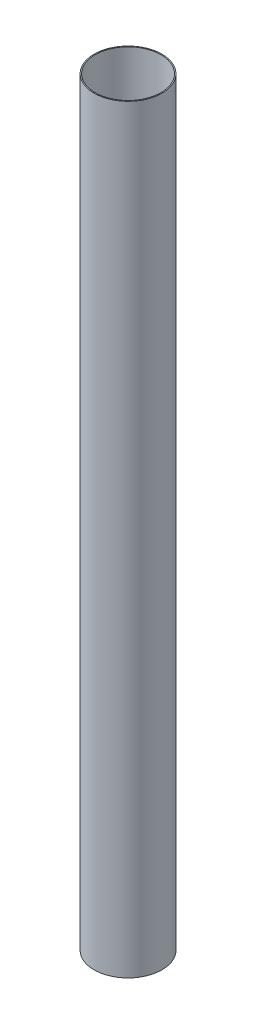
ISO-10303-21;
HEADER;
FILE_DESCRIPTION(('STEP AP214'),'2;1');
FILE_NAME('part.step','',(''),(''),'','','');
FILE_SCHEMA(('AUTOMOTIVE_DESIGN { 1 0 10303 214 1 1 1 1 }'));
ENDSEC;
DATA;
#1=APPLICATION_CONTEXT('core data for automotive mechanical design processes');
#2=APPLICATION_PROTOCOL_DEFINITION('international standard','automotive_design',2000,#1);
#3=PRODUCT_CONTEXT('',#1,'mechanical');
#4=PRODUCT('Part','Part','',(#3));
#5=PRODUCT_RELATED_PRODUCT_CATEGORY('part','',(#4));
#6=PRODUCT_DEFINITION_FORMATION('','',#4);
#7=PRODUCT_DEFINITION_CONTEXT('part definition',#1,'design');
#8=PRODUCT_DEFINITION('design','',#6,#7);
#9=PRODUCT_DEFINITION_SHAPE('','',#8);
#10=(LENGTH_UNIT() NAMED_UNIT(*) SI_UNIT(.MILLI.,.METRE.));
#11=(NAMED_UNIT(*) PLANE_ANGLE_UNIT() SI_UNIT($,.RADIAN.));
#12=(NAMED_UNIT(*) SI_UNIT($,.STERADIAN.) SOLID_ANGLE_UNIT());
#13=UNCERTAINTY_MEASURE_WITH_UNIT(LENGTH_MEASURE(1.E-05),#10,'distance_accuracy_value','');
#14=(GEOMETRIC_REPRESENTATION_CONTEXT(3) GLOBAL_UNCERTAINTY_ASSIGNED_CONTEXT((#13)) GLOBAL_UNIT_ASSIGNED_CONTEXT((#10,
#11,#12)) REPRESENTATION_CONTEXT('',''));
#15=CARTESIAN_POINT('',(0.,0.,0.));
#16=DIRECTION('',(0.,0.,1.));
#17=DIRECTION('',(1.,0.,0.));
#18=AXIS2_PLACEMENT_3D('',#15,#16,#17);
#19=CARTESIAN_POINT('',(0.,-88.99,0.));
#20=DIRECTION('',(0.,-1.,0.));
#21=DIRECTION('',(0.,0.,-1.));
#22=AXIS2_PLACEMENT_3D('',#19,#20,#21);
#23=CYLINDRICAL_SURFACE('',#22,49.53);
#24=CARTESIAN_POINT('',(0.,1778.,0.));
#25=DIRECTION('',(0.,-1.,0.));
#26=DIRECTION('',(0.,0.,-1.));
#27=AXIS2_PLACEMENT_3D('',#24,#25,#26);
#28=CIRCLE('',#27,49.53);
#29=CARTESIAN_POINT('',(0.,1778.,-49.53));
#30=VERTEX_POINT('',#29);
#31=EDGE_CURVE('E59',#30,#30,#28,.T.);
#32=ORIENTED_EDGE('',*,*,#31,.F.);
#33=EDGE_LOOP('',(#32));
#34=FACE_BOUND('',#33,.T.);
#35=CARTESIAN_POINT('',(0.,635.,0.));
#36=DIRECTION('',(0.,-1.,0.));
#37=DIRECTION('',(0.,0.,-1.));
#38=AXIS2_PLACEMENT_3D('',#35,#36,#37);
#39=CIRCLE('',#38,49.53);
#40=CARTESIAN_POINT('',(0.,635.,-49.53));
#41=VERTEX_POINT('',#40);
#42=EDGE_CURVE('E10',#41,#41,#39,.T.);
#43=ORIENTED_EDGE('',*,*,#42,.T.);
#44=EDGE_LOOP('',(#43));
#45=FACE_BOUND('',#44,.T.);
#46=ADVANCED_FACE('F45',(#34,#45),#23,.F.);
#47=CARTESIAN_POINT('',(-51.054,635.,0.));
#48=DIRECTION('',(0.,1.,0.));
#49=DIRECTION('',(0.,0.,1.));
#50=AXIS2_PLACEMENT_3D('',#47,#48,#49);
#51=PLANE('',#50);
#52=ORIENTED_EDGE('',*,*,#42,.F.);
#53=EDGE_LOOP('',(#52));
#54=FACE_BOUND('',#53,.T.);
#55=CARTESIAN_POINT('',(0.,635.,0.));
#56=DIRECTION('',(0.,-1.,0.));
#57=DIRECTION('',(0.,0.,-1.));
#58=AXIS2_PLACEMENT_3D('',#55,#56,#57);
#59=CIRCLE('',#58,51.054);
#60=CARTESIAN_POINT('',(0.,635.,-51.054));
#61=VERTEX_POINT('',#60);
#62=EDGE_CURVE('E51',#61,#61,#59,.T.);
#63=ORIENTED_EDGE('',*,*,#62,.T.);
#64=EDGE_LOOP('',(#63));
#65=FACE_BOUND('',#64,.T.);
#66=ADVANCED_FACE('F68',(#54,#65),#51,.F.);
#67=CARTESIAN_POINT('',(0.,-88.99,0.));
#68=DIRECTION('',(0.,-1.,0.));
#69=DIRECTION('',(0.,0.,-1.));
#70=AXIS2_PLACEMENT_3D('',#67,#68,#69);
#71=CYLINDRICAL_SURFACE('',#70,51.054);
#72=ORIENTED_EDGE('',*,*,#62,.F.);
#73=EDGE_LOOP('',(#72));
#74=FACE_BOUND('',#73,.T.);
#75=CARTESIAN_POINT('',(0.,1778.,0.));
#76=DIRECTION('',(0.,-1.,0.));
#77=DIRECTION('',(0.,0.,-1.));
#78=AXIS2_PLACEMENT_3D('',#75,#76,#77);
#79=CIRCLE('',#78,51.054);
#80=CARTESIAN_POINT('',(0.,1778.,-51.054));
#81=VERTEX_POINT('',#80);
#82=EDGE_CURVE('E55',#81,#81,#79,.T.);
#83=ORIENTED_EDGE('',*,*,#82,.T.);
#84=EDGE_LOOP('',(#83));
#85=FACE_BOUND('',#84,.T.);
#86=ADVANCED_FACE('F72',(#74,#85),#71,.T.);
#87=CARTESIAN_POINT('',(-51.054,1778.,0.));
#88=DIRECTION('',(0.,-1.,0.));
#89=DIRECTION('',(0.,0.,-1.));
#90=AXIS2_PLACEMENT_3D('',#87,#88,#89);
#91=PLANE('',#90);
#92=ORIENTED_EDGE('',*,*,#82,.F.);
#93=EDGE_LOOP('',(#92));
#94=FACE_BOUND('',#93,.T.);
#95=ORIENTED_EDGE('',*,*,#31,.T.);
#96=EDGE_LOOP('',(#95));
#97=FACE_BOUND('',#96,.T.);
#98=ADVANCED_FACE('F65',(#94,#97),#91,.F.);
#99=CLOSED_SHELL('',(#46,#66,#86,#98));
#100=MANIFOLD_SOLID_BREP('B2',#99);
#101=ADVANCED_BREP_SHAPE_REPRESENTATION('',(#18,#100),#14);
#102=SHAPE_DEFINITION_REPRESENTATION(#9,#101);
ENDSEC;
END-ISO-10303-21;
